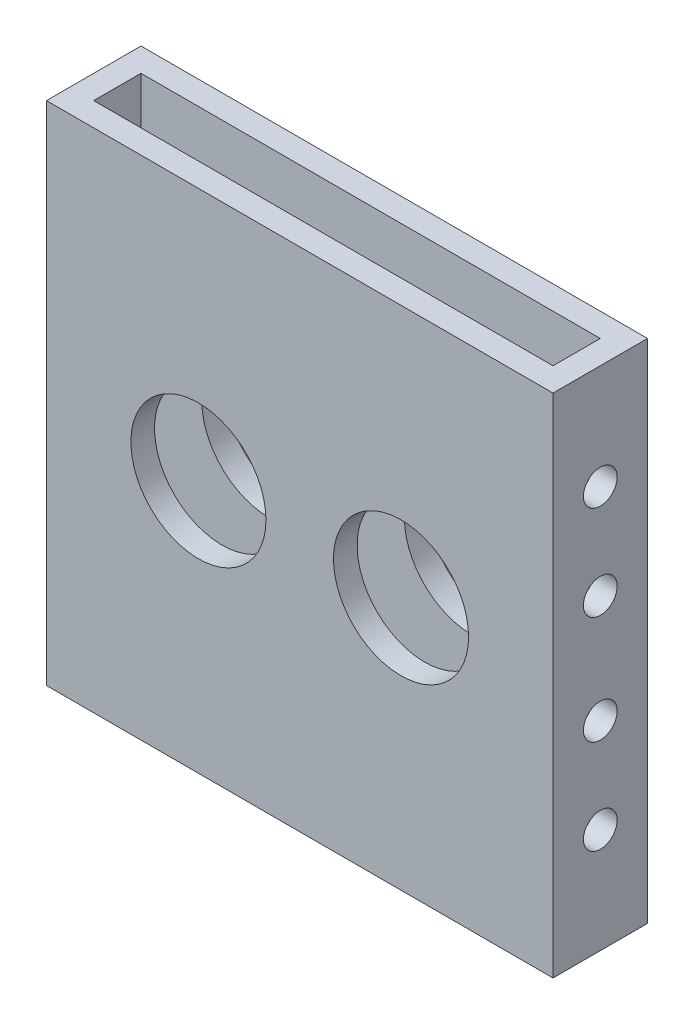
ISO-10303-21;
HEADER;
FILE_DESCRIPTION(('STEP AP214'),'2;1');
FILE_NAME('part.step','',(''),(''),'','','');
FILE_SCHEMA(('AUTOMOTIVE_DESIGN { 1 0 10303 214 1 1 1 1 }'));
ENDSEC;
DATA;
#1=APPLICATION_CONTEXT('core data for automotive mechanical design processes');
#2=APPLICATION_PROTOCOL_DEFINITION('international standard','automotive_design',2000,#1);
#3=PRODUCT_CONTEXT('',#1,'mechanical');
#4=PRODUCT('Part','Part','',(#3));
#5=PRODUCT_RELATED_PRODUCT_CATEGORY('part','',(#4));
#6=PRODUCT_DEFINITION_FORMATION('','',#4);
#7=PRODUCT_DEFINITION_CONTEXT('part definition',#1,'design');
#8=PRODUCT_DEFINITION('design','',#6,#7);
#9=PRODUCT_DEFINITION_SHAPE('','',#8);
#10=(LENGTH_UNIT() NAMED_UNIT(*) SI_UNIT(.MILLI.,.METRE.));
#11=(NAMED_UNIT(*) PLANE_ANGLE_UNIT() SI_UNIT($,.RADIAN.));
#12=(NAMED_UNIT(*) SI_UNIT($,.STERADIAN.) SOLID_ANGLE_UNIT());
#13=UNCERTAINTY_MEASURE_WITH_UNIT(LENGTH_MEASURE(1.E-05),#10,'distance_accuracy_value','');
#14=(GEOMETRIC_REPRESENTATION_CONTEXT(3) GLOBAL_UNCERTAINTY_ASSIGNED_CONTEXT((#13)) GLOBAL_UNIT_ASSIGNED_CONTEXT((#10,
#11,#12)) REPRESENTATION_CONTEXT('',''));
#15=CARTESIAN_POINT('',(0.,0.,0.));
#16=DIRECTION('',(0.,0.,1.));
#17=DIRECTION('',(1.,0.,0.));
#18=AXIS2_PLACEMENT_3D('',#15,#16,#17);
#19=CARTESIAN_POINT('',(47.625,-47.625,-17.78));
#20=DIRECTION('',(1.,0.,0.));
#21=DIRECTION('',(0.,0.,-1.));
#22=AXIS2_PLACEMENT_3D('',#19,#20,#21);
#23=PLANE('',#22);
#24=CARTESIAN_POINT('',(47.625,-27.94,-8.89));
#25=DIRECTION('',(1.,0.,0.));
#26=DIRECTION('',(0.,0.,-1.));
#27=AXIS2_PLACEMENT_3D('',#24,#25,#26);
#28=CIRCLE('',#27,3.175);
#29=CARTESIAN_POINT('',(47.625,-27.94,-12.065));
#30=VERTEX_POINT('',#29);
#31=EDGE_CURVE('E273',#30,#30,#28,.T.);
#32=ORIENTED_EDGE('',*,*,#31,.F.);
#33=EDGE_LOOP('',(#32));
#34=FACE_BOUND('',#33,.T.);
#35=CARTESIAN_POINT('',(47.625,-10.16,-8.89));
#36=DIRECTION('',(1.,0.,0.));
#37=DIRECTION('',(0.,0.,-1.));
#38=AXIS2_PLACEMENT_3D('',#35,#36,#37);
#39=CIRCLE('',#38,3.175);
#40=CARTESIAN_POINT('',(47.625,-10.16,-12.065));
#41=VERTEX_POINT('',#40);
#42=EDGE_CURVE('E277',#41,#41,#39,.F.);
#43=ORIENTED_EDGE('',*,*,#42,.T.);
#44=EDGE_LOOP('',(#43));
#45=FACE_BOUND('',#44,.T.);
#46=CARTESIAN_POINT('',(47.625,10.16,-8.89));
#47=DIRECTION('',(1.,0.,0.));
#48=DIRECTION('',(0.,0.,-1.));
#49=AXIS2_PLACEMENT_3D('',#46,#47,#48);
#50=CIRCLE('',#49,3.175);
#51=CARTESIAN_POINT('',(47.625,10.16,-12.065));
#52=VERTEX_POINT('',#51);
#53=EDGE_CURVE('E281',#52,#52,#50,.T.);
#54=ORIENTED_EDGE('',*,*,#53,.F.);
#55=EDGE_LOOP('',(#54));
#56=FACE_BOUND('',#55,.T.);
#57=DIRECTION('',(0.,1.,0.));
#58=VECTOR('',#57,1.);
#59=CARTESIAN_POINT('',(47.625,-47.625,0.));
#60=LINE('',#59,#58);
#61=CARTESIAN_POINT('',(47.625,-47.625,0.));
#62=VERTEX_POINT('',#61);
#63=CARTESIAN_POINT('',(47.625,47.625,0.));
#64=VERTEX_POINT('',#63);
#65=EDGE_CURVE('E153',#62,#64,#60,.T.);
#66=ORIENTED_EDGE('',*,*,#65,.F.);
#67=DIRECTION('',(0.,0.,1.));
#68=VECTOR('',#67,1.);
#69=CARTESIAN_POINT('',(47.625,-47.625,-17.78));
#70=LINE('',#69,#68);
#71=CARTESIAN_POINT('',(47.625,-47.625,-17.78));
#72=VERTEX_POINT('',#71);
#73=EDGE_CURVE('E13',#72,#62,#70,.T.);
#74=ORIENTED_EDGE('',*,*,#73,.F.);
#75=DIRECTION('',(0.,1.,0.));
#76=VECTOR('',#75,1.);
#77=CARTESIAN_POINT('',(47.625,-47.625,-17.78));
#78=LINE('',#77,#76);
#79=CARTESIAN_POINT('',(47.625,47.625,-17.78));
#80=VERTEX_POINT('',#79);
#81=EDGE_CURVE('E157',#72,#80,#78,.T.);
#82=ORIENTED_EDGE('',*,*,#81,.T.);
#83=DIRECTION('',(0.,0.,1.));
#84=VECTOR('',#83,1.);
#85=CARTESIAN_POINT('',(47.625,47.625,-17.78));
#86=LINE('',#85,#84);
#87=EDGE_CURVE('E170',#80,#64,#86,.T.);
#88=ORIENTED_EDGE('',*,*,#87,.T.);
#89=EDGE_LOOP('',(#66,#74,#82,#88));
#90=FACE_BOUND('',#89,.T.);
#91=CARTESIAN_POINT('',(47.625,27.94,-8.89));
#92=DIRECTION('',(1.,0.,0.));
#93=DIRECTION('',(0.,0.,-1.));
#94=AXIS2_PLACEMENT_3D('',#91,#92,#93);
#95=CIRCLE('',#94,3.175);
#96=CARTESIAN_POINT('',(47.625,27.94,-12.065));
#97=VERTEX_POINT('',#96);
#98=EDGE_CURVE('E286',#97,#97,#95,.F.);
#99=ORIENTED_EDGE('',*,*,#98,.T.);
#100=EDGE_LOOP('',(#99));
#101=FACE_BOUND('',#100,.T.);
#102=ADVANCED_FACE('F50',(#34,#45,#56,#90,#101),#23,.T.);
#103=CARTESIAN_POINT('',(-47.625,-47.625,-17.78));
#104=DIRECTION('',(-1.,0.,0.));
#105=DIRECTION('',(0.,0.,1.));
#106=AXIS2_PLACEMENT_3D('',#103,#104,#105);
#107=PLANE('',#106);
#108=CARTESIAN_POINT('',(-47.625,-27.94,-8.89));
#109=DIRECTION('',(1.,0.,0.));
#110=DIRECTION('',(0.,0.,-1.));
#111=AXIS2_PLACEMENT_3D('',#108,#109,#110);
#112=CIRCLE('',#111,3.175);
#113=CARTESIAN_POINT('',(-47.625,-27.94,-12.065));
#114=VERTEX_POINT('',#113);
#115=EDGE_CURVE('E289',#114,#114,#112,.T.);
#116=ORIENTED_EDGE('',*,*,#115,.T.);
#117=EDGE_LOOP('',(#116));
#118=FACE_BOUND('',#117,.T.);
#119=CARTESIAN_POINT('',(-47.625,-10.16,-8.89));
#120=DIRECTION('',(1.,0.,0.));
#121=DIRECTION('',(0.,0.,-1.));
#122=AXIS2_PLACEMENT_3D('',#119,#120,#121);
#123=CIRCLE('',#122,3.175);
#124=CARTESIAN_POINT('',(-47.625,-10.16,-12.065));
#125=VERTEX_POINT('',#124);
#126=EDGE_CURVE('E299',#125,#125,#123,.F.);
#127=ORIENTED_EDGE('',*,*,#126,.F.);
#128=EDGE_LOOP('',(#127));
#129=FACE_BOUND('',#128,.T.);
#130=CARTESIAN_POINT('',(-47.625,10.16,-8.89));
#131=DIRECTION('',(1.,0.,0.));
#132=DIRECTION('',(0.,0.,-1.));
#133=AXIS2_PLACEMENT_3D('',#130,#131,#132);
#134=CIRCLE('',#133,3.175);
#135=CARTESIAN_POINT('',(-47.625,10.16,-12.065));
#136=VERTEX_POINT('',#135);
#137=EDGE_CURVE('E197',#136,#136,#134,.T.);
#138=ORIENTED_EDGE('',*,*,#137,.T.);
#139=EDGE_LOOP('',(#138));
#140=FACE_BOUND('',#139,.T.);
#141=DIRECTION('',(0.,-1.,0.));
#142=VECTOR('',#141,1.);
#143=CARTESIAN_POINT('',(-47.625,-47.625,0.));
#144=LINE('',#143,#142);
#145=CARTESIAN_POINT('',(-47.625,47.625,0.));
#146=VERTEX_POINT('',#145);
#147=CARTESIAN_POINT('',(-47.625,-47.625,0.));
#148=VERTEX_POINT('',#147);
#149=EDGE_CURVE('E176',#146,#148,#144,.T.);
#150=ORIENTED_EDGE('',*,*,#149,.F.);
#151=DIRECTION('',(0.,0.,1.));
#152=VECTOR('',#151,1.);
#153=CARTESIAN_POINT('',(-47.625,47.625,-17.78));
#154=LINE('',#153,#152);
#155=CARTESIAN_POINT('',(-47.625,47.625,-17.78));
#156=VERTEX_POINT('',#155);
#157=EDGE_CURVE('E182',#156,#146,#154,.T.);
#158=ORIENTED_EDGE('',*,*,#157,.F.);
#159=DIRECTION('',(0.,-1.,0.));
#160=VECTOR('',#159,1.);
#161=CARTESIAN_POINT('',(-47.625,-47.625,-17.78));
#162=LINE('',#161,#160);
#163=CARTESIAN_POINT('',(-47.625,-47.625,-17.78));
#164=VERTEX_POINT('',#163);
#165=EDGE_CURVE('E164',#156,#164,#162,.T.);
#166=ORIENTED_EDGE('',*,*,#165,.T.);
#167=DIRECTION('',(0.,0.,1.));
#168=VECTOR('',#167,1.);
#169=CARTESIAN_POINT('',(-47.625,-47.625,-17.78));
#170=LINE('',#169,#168);
#171=EDGE_CURVE('E58',#164,#148,#170,.T.);
#172=ORIENTED_EDGE('',*,*,#171,.T.);
#173=EDGE_LOOP('',(#150,#158,#166,#172));
#174=FACE_BOUND('',#173,.T.);
#175=CARTESIAN_POINT('',(-47.625,27.94,-8.89));
#176=DIRECTION('',(1.,0.,0.));
#177=DIRECTION('',(0.,0.,-1.));
#178=AXIS2_PLACEMENT_3D('',#175,#176,#177);
#179=CIRCLE('',#178,3.175);
#180=CARTESIAN_POINT('',(-47.625,27.94,-12.065));
#181=VERTEX_POINT('',#180);
#182=EDGE_CURVE('E288',#181,#181,#179,.F.);
#183=ORIENTED_EDGE('',*,*,#182,.F.);
#184=EDGE_LOOP('',(#183));
#185=FACE_BOUND('',#184,.T.);
#186=ADVANCED_FACE('F263',(#118,#129,#140,#174,#185),#107,.T.);
#187=CARTESIAN_POINT('',(-43.18,-47.625,-13.335));
#188=DIRECTION('',(-1.,0.,0.));
#189=DIRECTION('',(0.,0.,1.));
#190=AXIS2_PLACEMENT_3D('',#187,#188,#189);
#191=PLANE('',#190);
#192=CARTESIAN_POINT('',(-43.18,-27.94,-8.89));
#193=DIRECTION('',(-1.,0.,0.));
#194=DIRECTION('',(0.,0.,1.));
#195=AXIS2_PLACEMENT_3D('',#192,#193,#194);
#196=CIRCLE('',#195,3.175);
#197=CARTESIAN_POINT('',(-43.18,-27.94,-5.715));
#198=VERTEX_POINT('',#197);
#199=EDGE_CURVE('E215',#198,#198,#196,.T.);
#200=ORIENTED_EDGE('',*,*,#199,.T.);
#201=EDGE_LOOP('',(#200));
#202=FACE_BOUND('',#201,.T.);
#203=CARTESIAN_POINT('',(-43.18,10.16,-8.89));
#204=DIRECTION('',(-1.,0.,0.));
#205=DIRECTION('',(0.,0.,1.));
#206=AXIS2_PLACEMENT_3D('',#203,#204,#205);
#207=CIRCLE('',#206,3.175);
#208=CARTESIAN_POINT('',(-43.18,10.16,-5.715));
#209=VERTEX_POINT('',#208);
#210=EDGE_CURVE('E196',#209,#209,#207,.T.);
#211=ORIENTED_EDGE('',*,*,#210,.T.);
#212=EDGE_LOOP('',(#211));
#213=FACE_BOUND('',#212,.T.);
#214=DIRECTION('',(0.,0.,1.));
#215=VECTOR('',#214,1.);
#216=CARTESIAN_POINT('',(-43.18,47.625,-13.335));
#217=LINE('',#216,#215);
#218=CARTESIAN_POINT('',(-43.18,47.625,-13.335));
#219=VERTEX_POINT('',#218);
#220=CARTESIAN_POINT('',(-43.18,47.625,-4.445));
#221=VERTEX_POINT('',#220);
#222=EDGE_CURVE('E74',#219,#221,#217,.T.);
#223=ORIENTED_EDGE('',*,*,#222,.T.);
#224=DIRECTION('',(0.,1.,0.));
#225=VECTOR('',#224,1.);
#226=CARTESIAN_POINT('',(-43.18,-47.625,-4.445));
#227=LINE('',#226,#225);
#228=CARTESIAN_POINT('',(-43.18,-47.625,-4.445));
#229=VERTEX_POINT('',#228);
#230=EDGE_CURVE('E113',#229,#221,#227,.T.);
#231=ORIENTED_EDGE('',*,*,#230,.F.);
#232=DIRECTION('',(0.,0.,1.));
#233=VECTOR('',#232,1.);
#234=CARTESIAN_POINT('',(-43.18,-47.625,-13.335));
#235=LINE('',#234,#233);
#236=CARTESIAN_POINT('',(-43.18,-47.625,-13.335));
#237=VERTEX_POINT('',#236);
#238=EDGE_CURVE('E118',#237,#229,#235,.T.);
#239=ORIENTED_EDGE('',*,*,#238,.F.);
#240=DIRECTION('',(0.,1.,0.));
#241=VECTOR('',#240,1.);
#242=CARTESIAN_POINT('',(-43.18,-47.625,-13.335));
#243=LINE('',#242,#241);
#244=EDGE_CURVE('E151',#237,#219,#243,.T.);
#245=ORIENTED_EDGE('',*,*,#244,.T.);
#246=EDGE_LOOP('',(#223,#231,#239,#245));
#247=FACE_BOUND('',#246,.T.);
#248=CARTESIAN_POINT('',(-43.18,-10.16,-8.89));
#249=DIRECTION('',(-1.,0.,0.));
#250=DIRECTION('',(0.,0.,1.));
#251=AXIS2_PLACEMENT_3D('',#248,#249,#250);
#252=CIRCLE('',#251,3.175);
#253=CARTESIAN_POINT('',(-43.18,-10.16,-5.715));
#254=VERTEX_POINT('',#253);
#255=EDGE_CURVE('E200',#254,#254,#252,.F.);
#256=ORIENTED_EDGE('',*,*,#255,.F.);
#257=EDGE_LOOP('',(#256));
#258=FACE_BOUND('',#257,.T.);
#259=CARTESIAN_POINT('',(-43.18,27.94,-8.89));
#260=DIRECTION('',(-1.,0.,0.));
#261=DIRECTION('',(0.,0.,1.));
#262=AXIS2_PLACEMENT_3D('',#259,#260,#261);
#263=CIRCLE('',#262,3.175);
#264=CARTESIAN_POINT('',(-43.18,27.94,-5.715));
#265=VERTEX_POINT('',#264);
#266=EDGE_CURVE('E203',#265,#265,#263,.F.);
#267=ORIENTED_EDGE('',*,*,#266,.F.);
#268=EDGE_LOOP('',(#267));
#269=FACE_BOUND('',#268,.T.);
#270=ADVANCED_FACE('F115',(#202,#213,#247,#258,#269),#191,.F.);
#271=CARTESIAN_POINT('',(43.18,-47.625,-4.445));
#272=DIRECTION('',(1.,0.,0.));
#273=DIRECTION('',(0.,0.,-1.));
#274=AXIS2_PLACEMENT_3D('',#271,#272,#273);
#275=PLANE('',#274);
#276=CARTESIAN_POINT('',(43.18,-27.94,-8.89));
#277=DIRECTION('',(1.,0.,0.));
#278=DIRECTION('',(0.,0.,-1.));
#279=AXIS2_PLACEMENT_3D('',#276,#277,#278);
#280=CIRCLE('',#279,3.175);
#281=CARTESIAN_POINT('',(43.18,-27.94,-12.065));
#282=VERTEX_POINT('',#281);
#283=EDGE_CURVE('E53',#282,#282,#280,.T.);
#284=ORIENTED_EDGE('',*,*,#283,.T.);
#285=EDGE_LOOP('',(#284));
#286=FACE_BOUND('',#285,.T.);
#287=CARTESIAN_POINT('',(43.18,10.16,-8.89));
#288=DIRECTION('',(1.,0.,0.));
#289=DIRECTION('',(0.,0.,-1.));
#290=AXIS2_PLACEMENT_3D('',#287,#288,#289);
#291=CIRCLE('',#290,3.175);
#292=CARTESIAN_POINT('',(43.18,10.16,-12.065));
#293=VERTEX_POINT('',#292);
#294=EDGE_CURVE('E193',#293,#293,#291,.T.);
#295=ORIENTED_EDGE('',*,*,#294,.T.);
#296=EDGE_LOOP('',(#295));
#297=FACE_BOUND('',#296,.T.);
#298=DIRECTION('',(0.,0.,-1.));
#299=VECTOR('',#298,1.);
#300=CARTESIAN_POINT('',(43.18,47.625,-4.445));
#301=LINE('',#300,#299);
#302=CARTESIAN_POINT('',(43.18,47.625,-4.445));
#303=VERTEX_POINT('',#302);
#304=CARTESIAN_POINT('',(43.18,47.625,-13.335));
#305=VERTEX_POINT('',#304);
#306=EDGE_CURVE('E138',#303,#305,#301,.T.);
#307=ORIENTED_EDGE('',*,*,#306,.T.);
#308=DIRECTION('',(0.,1.,0.));
#309=VECTOR('',#308,1.);
#310=CARTESIAN_POINT('',(43.18,-47.625,-13.335));
#311=LINE('',#310,#309);
#312=CARTESIAN_POINT('',(43.18,-47.625,-13.335));
#313=VERTEX_POINT('',#312);
#314=EDGE_CURVE('E154',#313,#305,#311,.T.);
#315=ORIENTED_EDGE('',*,*,#314,.F.);
#316=DIRECTION('',(0.,0.,-1.));
#317=VECTOR('',#316,1.);
#318=CARTESIAN_POINT('',(43.18,-47.625,-4.445));
#319=LINE('',#318,#317);
#320=CARTESIAN_POINT('',(43.18,-47.625,-4.445));
#321=VERTEX_POINT('',#320);
#322=EDGE_CURVE('E66',#321,#313,#319,.T.);
#323=ORIENTED_EDGE('',*,*,#322,.F.);
#324=DIRECTION('',(0.,1.,0.));
#325=VECTOR('',#324,1.);
#326=CARTESIAN_POINT('',(43.18,-47.625,-4.445));
#327=LINE('',#326,#325);
#328=EDGE_CURVE('E123',#321,#303,#327,.T.);
#329=ORIENTED_EDGE('',*,*,#328,.T.);
#330=EDGE_LOOP('',(#307,#315,#323,#329));
#331=FACE_BOUND('',#330,.T.);
#332=CARTESIAN_POINT('',(43.18,-10.16,-8.89));
#333=DIRECTION('',(1.,0.,0.));
#334=DIRECTION('',(0.,0.,-1.));
#335=AXIS2_PLACEMENT_3D('',#332,#333,#334);
#336=CIRCLE('',#335,3.175);
#337=CARTESIAN_POINT('',(43.18,-10.16,-12.065));
#338=VERTEX_POINT('',#337);
#339=EDGE_CURVE('E198',#338,#338,#336,.F.);
#340=ORIENTED_EDGE('',*,*,#339,.F.);
#341=EDGE_LOOP('',(#340));
#342=FACE_BOUND('',#341,.T.);
#343=CARTESIAN_POINT('',(43.18,27.94,-8.89));
#344=DIRECTION('',(1.,0.,0.));
#345=DIRECTION('',(0.,0.,-1.));
#346=AXIS2_PLACEMENT_3D('',#343,#344,#345);
#347=CIRCLE('',#346,3.175);
#348=CARTESIAN_POINT('',(43.18,27.94,-12.065));
#349=VERTEX_POINT('',#348);
#350=EDGE_CURVE('E201',#349,#349,#347,.F.);
#351=ORIENTED_EDGE('',*,*,#350,.F.);
#352=EDGE_LOOP('',(#351));
#353=FACE_BOUND('',#352,.T.);
#354=ADVANCED_FACE('F322',(#286,#297,#331,#342,#353),#275,.F.);
#355=CARTESIAN_POINT('',(0.,0.,-17.78));
#356=DIRECTION('',(0.,0.,-1.));
#357=DIRECTION('',(-1.,0.,0.));
#358=AXIS2_PLACEMENT_3D('',#355,#356,#357);
#359=PLANE('',#358);
#360=CARTESIAN_POINT('',(-19.05,0.,-17.78));
#361=DIRECTION('',(0.,0.,1.));
#362=DIRECTION('',(1.,0.,0.));
#363=AXIS2_PLACEMENT_3D('',#360,#361,#362);
#364=CIRCLE('',#363,12.7);
#365=CARTESIAN_POINT('',(-6.35,0.,-17.78));
#366=VERTEX_POINT('',#365);
#367=EDGE_CURVE('E224',#366,#366,#364,.F.);
#368=ORIENTED_EDGE('',*,*,#367,.F.);
#369=EDGE_LOOP('',(#368));
#370=FACE_BOUND('',#369,.T.);
#371=ORIENTED_EDGE('',*,*,#81,.F.);
#372=DIRECTION('',(1.,0.,0.));
#373=VECTOR('',#372,1.);
#374=CARTESIAN_POINT('',(-47.625,-47.625,-17.78));
#375=LINE('',#374,#373);
#376=EDGE_CURVE('E167',#164,#72,#375,.T.);
#377=ORIENTED_EDGE('',*,*,#376,.F.);
#378=ORIENTED_EDGE('',*,*,#165,.F.);
#379=DIRECTION('',(-1.,0.,0.));
#380=VECTOR('',#379,1.);
#381=CARTESIAN_POINT('',(-47.625,47.625,-17.78));
#382=LINE('',#381,#380);
#383=EDGE_CURVE('E160',#80,#156,#382,.T.);
#384=ORIENTED_EDGE('',*,*,#383,.F.);
#385=EDGE_LOOP('',(#371,#377,#378,#384));
#386=FACE_BOUND('',#385,.T.);
#387=CARTESIAN_POINT('',(19.05,0.,-17.78));
#388=DIRECTION('',(0.,0.,1.));
#389=DIRECTION('',(1.,0.,0.));
#390=AXIS2_PLACEMENT_3D('',#387,#388,#389);
#391=CIRCLE('',#390,12.7);
#392=CARTESIAN_POINT('',(31.75,0.,-17.78));
#393=VERTEX_POINT('',#392);
#394=EDGE_CURVE('E189',#393,#393,#391,.T.);
#395=ORIENTED_EDGE('',*,*,#394,.T.);
#396=EDGE_LOOP('',(#395));
#397=FACE_BOUND('',#396,.T.);
#398=ADVANCED_FACE('F328',(#370,#386,#397),#359,.T.);
#399=CARTESIAN_POINT('',(0.,0.,0.));
#400=DIRECTION('',(0.,0.,-1.));
#401=DIRECTION('',(-1.,0.,0.));
#402=AXIS2_PLACEMENT_3D('',#399,#400,#401);
#403=PLANE('',#402);
#404=ORIENTED_EDGE('',*,*,#65,.T.);
#405=DIRECTION('',(-1.,0.,0.));
#406=VECTOR('',#405,1.);
#407=CARTESIAN_POINT('',(-47.625,47.625,0.));
#408=LINE('',#407,#406);
#409=EDGE_CURVE('E173',#64,#146,#408,.T.);
#410=ORIENTED_EDGE('',*,*,#409,.T.);
#411=ORIENTED_EDGE('',*,*,#149,.T.);
#412=DIRECTION('',(1.,0.,0.));
#413=VECTOR('',#412,1.);
#414=CARTESIAN_POINT('',(-47.625,-47.625,0.));
#415=LINE('',#414,#413);
#416=EDGE_CURVE('E161',#148,#62,#415,.T.);
#417=ORIENTED_EDGE('',*,*,#416,.T.);
#418=EDGE_LOOP('',(#404,#410,#411,#417));
#419=FACE_BOUND('',#418,.T.);
#420=CARTESIAN_POINT('',(-19.05,0.,0.));
#421=DIRECTION('',(0.,0.,1.));
#422=DIRECTION('',(1.,0.,0.));
#423=AXIS2_PLACEMENT_3D('',#420,#421,#422);
#424=CIRCLE('',#423,12.7);
#425=CARTESIAN_POINT('',(-6.35,0.,0.));
#426=VERTEX_POINT('',#425);
#427=EDGE_CURVE('E218',#426,#426,#424,.F.);
#428=ORIENTED_EDGE('',*,*,#427,.T.);
#429=EDGE_LOOP('',(#428));
#430=FACE_BOUND('',#429,.T.);
#431=CARTESIAN_POINT('',(19.05,0.,0.));
#432=DIRECTION('',(0.,0.,1.));
#433=DIRECTION('',(1.,0.,0.));
#434=AXIS2_PLACEMENT_3D('',#431,#432,#433);
#435=CIRCLE('',#434,12.7);
#436=CARTESIAN_POINT('',(31.75,0.,0.));
#437=VERTEX_POINT('',#436);
#438=EDGE_CURVE('E221',#437,#437,#435,.T.);
#439=ORIENTED_EDGE('',*,*,#438,.F.);
#440=EDGE_LOOP('',(#439));
#441=FACE_BOUND('',#440,.T.);
#442=ADVANCED_FACE('F236',(#419,#430,#441),#403,.F.);
#443=CARTESIAN_POINT('',(43.18,-47.625,-13.335));
#444=DIRECTION('',(0.,0.,-1.));
#445=DIRECTION('',(-1.,0.,0.));
#446=AXIS2_PLACEMENT_3D('',#443,#444,#445);
#447=PLANE('',#446);
#448=DIRECTION('',(-1.,0.,0.));
#449=VECTOR('',#448,1.);
#450=CARTESIAN_POINT('',(43.18,47.625,-13.335));
#451=LINE('',#450,#449);
#452=EDGE_CURVE('E135',#305,#219,#451,.T.);
#453=ORIENTED_EDGE('',*,*,#452,.T.);
#454=ORIENTED_EDGE('',*,*,#244,.F.);
#455=DIRECTION('',(-1.,0.,0.));
#456=VECTOR('',#455,1.);
#457=CARTESIAN_POINT('',(43.18,-47.625,-13.335));
#458=LINE('',#457,#456);
#459=EDGE_CURVE('E124',#313,#237,#458,.T.);
#460=ORIENTED_EDGE('',*,*,#459,.F.);
#461=ORIENTED_EDGE('',*,*,#314,.T.);
#462=EDGE_LOOP('',(#453,#454,#460,#461));
#463=FACE_BOUND('',#462,.T.);
#464=CARTESIAN_POINT('',(-19.05,0.,-13.335));
#465=DIRECTION('',(0.,0.,-1.));
#466=DIRECTION('',(-1.,0.,0.));
#467=AXIS2_PLACEMENT_3D('',#464,#465,#466);
#468=CIRCLE('',#467,12.7);
#469=CARTESIAN_POINT('',(-31.75,0.,-13.335));
#470=VERTEX_POINT('',#469);
#471=EDGE_CURVE('E188',#470,#470,#468,.F.);
#472=ORIENTED_EDGE('',*,*,#471,.F.);
#473=EDGE_LOOP('',(#472));
#474=FACE_BOUND('',#473,.T.);
#475=CARTESIAN_POINT('',(19.05,0.,-13.335));
#476=DIRECTION('',(0.,0.,-1.));
#477=DIRECTION('',(-1.,0.,0.));
#478=AXIS2_PLACEMENT_3D('',#475,#476,#477);
#479=CIRCLE('',#478,12.7);
#480=CARTESIAN_POINT('',(6.35,0.,-13.335));
#481=VERTEX_POINT('',#480);
#482=EDGE_CURVE('E141',#481,#481,#479,.T.);
#483=ORIENTED_EDGE('',*,*,#482,.T.);
#484=EDGE_LOOP('',(#483));
#485=FACE_BOUND('',#484,.T.);
#486=ADVANCED_FACE('F233',(#463,#474,#485),#447,.F.);
#487=CARTESIAN_POINT('',(-43.18,-47.625,-4.445));
#488=DIRECTION('',(0.,0.,1.));
#489=DIRECTION('',(1.,0.,0.));
#490=AXIS2_PLACEMENT_3D('',#487,#488,#489);
#491=PLANE('',#490);
#492=DIRECTION('',(1.,0.,0.));
#493=VECTOR('',#492,1.);
#494=CARTESIAN_POINT('',(-43.18,47.625,-4.445));
#495=LINE('',#494,#493);
#496=EDGE_CURVE('E147',#221,#303,#495,.T.);
#497=ORIENTED_EDGE('',*,*,#496,.T.);
#498=ORIENTED_EDGE('',*,*,#328,.F.);
#499=DIRECTION('',(1.,0.,0.));
#500=VECTOR('',#499,1.);
#501=CARTESIAN_POINT('',(-43.18,-47.625,-4.445));
#502=LINE('',#501,#500);
#503=EDGE_CURVE('E127',#229,#321,#502,.T.);
#504=ORIENTED_EDGE('',*,*,#503,.F.);
#505=ORIENTED_EDGE('',*,*,#230,.T.);
#506=EDGE_LOOP('',(#497,#498,#504,#505));
#507=FACE_BOUND('',#506,.T.);
#508=CARTESIAN_POINT('',(-19.05,0.,-4.445));
#509=DIRECTION('',(0.,0.,1.));
#510=DIRECTION('',(1.,0.,0.));
#511=AXIS2_PLACEMENT_3D('',#508,#509,#510);
#512=CIRCLE('',#511,12.7);
#513=CARTESIAN_POINT('',(-6.35,0.,-4.445));
#514=VERTEX_POINT('',#513);
#515=EDGE_CURVE('E185',#514,#514,#512,.F.);
#516=ORIENTED_EDGE('',*,*,#515,.F.);
#517=EDGE_LOOP('',(#516));
#518=FACE_BOUND('',#517,.T.);
#519=CARTESIAN_POINT('',(19.05,0.,-4.445));
#520=DIRECTION('',(0.,0.,1.));
#521=DIRECTION('',(1.,0.,0.));
#522=AXIS2_PLACEMENT_3D('',#519,#520,#521);
#523=CIRCLE('',#522,12.7);
#524=CARTESIAN_POINT('',(31.75,0.,-4.445));
#525=VERTEX_POINT('',#524);
#526=EDGE_CURVE('E190',#525,#525,#523,.T.);
#527=ORIENTED_EDGE('',*,*,#526,.T.);
#528=EDGE_LOOP('',(#527));
#529=FACE_BOUND('',#528,.T.);
#530=ADVANCED_FACE('F128',(#507,#518,#529),#491,.F.);
#531=CARTESIAN_POINT('',(-47.625,-47.625,-17.78));
#532=DIRECTION('',(0.,-1.,0.));
#533=DIRECTION('',(0.,0.,-1.));
#534=AXIS2_PLACEMENT_3D('',#531,#532,#533);
#535=PLANE('',#534);
#536=ORIENTED_EDGE('',*,*,#238,.T.);
#537=ORIENTED_EDGE('',*,*,#503,.T.);
#538=ORIENTED_EDGE('',*,*,#322,.T.);
#539=ORIENTED_EDGE('',*,*,#459,.T.);
#540=EDGE_LOOP('',(#536,#537,#538,#539));
#541=FACE_BOUND('',#540,.T.);
#542=ORIENTED_EDGE('',*,*,#416,.F.);
#543=ORIENTED_EDGE('',*,*,#171,.F.);
#544=ORIENTED_EDGE('',*,*,#376,.T.);
#545=ORIENTED_EDGE('',*,*,#73,.T.);
#546=EDGE_LOOP('',(#542,#543,#544,#545));
#547=FACE_BOUND('',#546,.T.);
#548=ADVANCED_FACE('F132',(#541,#547),#535,.T.);
#549=CARTESIAN_POINT('',(-47.625,47.625,-17.78));
#550=DIRECTION('',(0.,1.,0.));
#551=DIRECTION('',(0.,0.,1.));
#552=AXIS2_PLACEMENT_3D('',#549,#550,#551);
#553=PLANE('',#552);
#554=ORIENTED_EDGE('',*,*,#222,.F.);
#555=ORIENTED_EDGE('',*,*,#452,.F.);
#556=ORIENTED_EDGE('',*,*,#306,.F.);
#557=ORIENTED_EDGE('',*,*,#496,.F.);
#558=EDGE_LOOP('',(#554,#555,#556,#557));
#559=FACE_BOUND('',#558,.T.);
#560=ORIENTED_EDGE('',*,*,#409,.F.);
#561=ORIENTED_EDGE('',*,*,#87,.F.);
#562=ORIENTED_EDGE('',*,*,#383,.T.);
#563=ORIENTED_EDGE('',*,*,#157,.T.);
#564=EDGE_LOOP('',(#560,#561,#562,#563));
#565=FACE_BOUND('',#564,.T.);
#566=ADVANCED_FACE('F341',(#559,#565),#553,.T.);
#567=CARTESIAN_POINT('',(-19.05,0.,-17.78));
#568=DIRECTION('',(0.,0.,1.));
#569=DIRECTION('',(1.,0.,0.));
#570=AXIS2_PLACEMENT_3D('',#567,#568,#569);
#571=CYLINDRICAL_SURFACE('',#570,12.7);
#572=ORIENTED_EDGE('',*,*,#427,.F.);
#573=EDGE_LOOP('',(#572));
#574=FACE_BOUND('',#573,.T.);
#575=ORIENTED_EDGE('',*,*,#515,.T.);
#576=EDGE_LOOP('',(#575));
#577=FACE_BOUND('',#576,.T.);
#578=ADVANCED_FACE('F258',(#574,#577),#571,.F.);
#579=CARTESIAN_POINT('',(19.05,0.,-17.78));
#580=DIRECTION('',(0.,0.,1.));
#581=DIRECTION('',(1.,0.,0.));
#582=AXIS2_PLACEMENT_3D('',#579,#580,#581);
#583=CYLINDRICAL_SURFACE('',#582,12.7);
#584=ORIENTED_EDGE('',*,*,#438,.T.);
#585=EDGE_LOOP('',(#584));
#586=FACE_BOUND('',#585,.T.);
#587=ORIENTED_EDGE('',*,*,#526,.F.);
#588=EDGE_LOOP('',(#587));
#589=FACE_BOUND('',#588,.T.);
#590=ADVANCED_FACE('F247',(#586,#589),#583,.F.);
#591=ORIENTED_EDGE('',*,*,#367,.T.);
#592=EDGE_LOOP('',(#591));
#593=FACE_BOUND('',#592,.T.);
#594=ORIENTED_EDGE('',*,*,#471,.T.);
#595=EDGE_LOOP('',(#594));
#596=FACE_BOUND('',#595,.T.);
#597=ADVANCED_FACE('F231',(#593,#596),#571,.F.);
#598=ORIENTED_EDGE('',*,*,#394,.F.);
#599=EDGE_LOOP('',(#598));
#600=FACE_BOUND('',#599,.T.);
#601=ORIENTED_EDGE('',*,*,#482,.F.);
#602=EDGE_LOOP('',(#601));
#603=FACE_BOUND('',#602,.T.);
#604=ADVANCED_FACE('F242',(#600,#603),#583,.F.);
#605=CARTESIAN_POINT('',(-47.625,10.16,-8.89));
#606=DIRECTION('',(1.,0.,0.));
#607=DIRECTION('',(0.,0.,-1.));
#608=AXIS2_PLACEMENT_3D('',#605,#606,#607);
#609=CYLINDRICAL_SURFACE('',#608,3.175);
#610=ORIENTED_EDGE('',*,*,#53,.T.);
#611=EDGE_LOOP('',(#610));
#612=FACE_BOUND('',#611,.T.);
#613=ORIENTED_EDGE('',*,*,#294,.F.);
#614=EDGE_LOOP('',(#613));
#615=FACE_BOUND('',#614,.T.);
#616=ADVANCED_FACE('F244',(#612,#615),#609,.F.);
#617=CARTESIAN_POINT('',(-47.625,-10.16,-8.89));
#618=DIRECTION('',(1.,0.,0.));
#619=DIRECTION('',(0.,0.,-1.));
#620=AXIS2_PLACEMENT_3D('',#617,#618,#619);
#621=CYLINDRICAL_SURFACE('',#620,3.175);
#622=ORIENTED_EDGE('',*,*,#42,.F.);
#623=EDGE_LOOP('',(#622));
#624=FACE_BOUND('',#623,.T.);
#625=ORIENTED_EDGE('',*,*,#339,.T.);
#626=EDGE_LOOP('',(#625));
#627=FACE_BOUND('',#626,.T.);
#628=ADVANCED_FACE('F252',(#624,#627),#621,.F.);
#629=CARTESIAN_POINT('',(-47.625,27.94,-8.89));
#630=DIRECTION('',(1.,0.,0.));
#631=DIRECTION('',(0.,0.,-1.));
#632=AXIS2_PLACEMENT_3D('',#629,#630,#631);
#633=CYLINDRICAL_SURFACE('',#632,3.175);
#634=ORIENTED_EDGE('',*,*,#98,.F.);
#635=EDGE_LOOP('',(#634));
#636=FACE_BOUND('',#635,.T.);
#637=ORIENTED_EDGE('',*,*,#350,.T.);
#638=EDGE_LOOP('',(#637));
#639=FACE_BOUND('',#638,.T.);
#640=ADVANCED_FACE('F318',(#636,#639),#633,.F.);
#641=CARTESIAN_POINT('',(-47.625,-27.94,-8.89));
#642=DIRECTION('',(1.,0.,0.));
#643=DIRECTION('',(0.,0.,-1.));
#644=AXIS2_PLACEMENT_3D('',#641,#642,#643);
#645=CYLINDRICAL_SURFACE('',#644,3.175);
#646=ORIENTED_EDGE('',*,*,#31,.T.);
#647=EDGE_LOOP('',(#646));
#648=FACE_BOUND('',#647,.T.);
#649=ORIENTED_EDGE('',*,*,#283,.F.);
#650=EDGE_LOOP('',(#649));
#651=FACE_BOUND('',#650,.T.);
#652=ADVANCED_FACE('F433',(#648,#651),#645,.F.);
#653=ORIENTED_EDGE('',*,*,#137,.F.);
#654=EDGE_LOOP('',(#653));
#655=FACE_BOUND('',#654,.T.);
#656=ORIENTED_EDGE('',*,*,#210,.F.);
#657=EDGE_LOOP('',(#656));
#658=FACE_BOUND('',#657,.T.);
#659=ADVANCED_FACE('F255',(#655,#658),#609,.F.);
#660=ORIENTED_EDGE('',*,*,#126,.T.);
#661=EDGE_LOOP('',(#660));
#662=FACE_BOUND('',#661,.T.);
#663=ORIENTED_EDGE('',*,*,#255,.T.);
#664=EDGE_LOOP('',(#663));
#665=FACE_BOUND('',#664,.T.);
#666=ADVANCED_FACE('F304',(#662,#665),#621,.F.);
#667=ORIENTED_EDGE('',*,*,#182,.T.);
#668=EDGE_LOOP('',(#667));
#669=FACE_BOUND('',#668,.T.);
#670=ORIENTED_EDGE('',*,*,#266,.T.);
#671=EDGE_LOOP('',(#670));
#672=FACE_BOUND('',#671,.T.);
#673=ADVANCED_FACE('F313',(#669,#672),#633,.F.);
#674=ORIENTED_EDGE('',*,*,#115,.F.);
#675=EDGE_LOOP('',(#674));
#676=FACE_BOUND('',#675,.T.);
#677=ORIENTED_EDGE('',*,*,#199,.F.);
#678=EDGE_LOOP('',(#677));
#679=FACE_BOUND('',#678,.T.);
#680=ADVANCED_FACE('F316',(#676,#679),#645,.F.);
#681=CLOSED_SHELL('',(#102,#186,#270,#354,#398,#442,#486,#530,#548,#566,#578,#590,#597,#604,
#616,#628,#640,#652,#659,#666,#673,#680));
#682=MANIFOLD_SOLID_BREP('B2',#681);
#683=ADVANCED_BREP_SHAPE_REPRESENTATION('',(#18,#682),#14);
#684=SHAPE_DEFINITION_REPRESENTATION(#9,#683);
ENDSEC;
END-ISO-10303-21;
